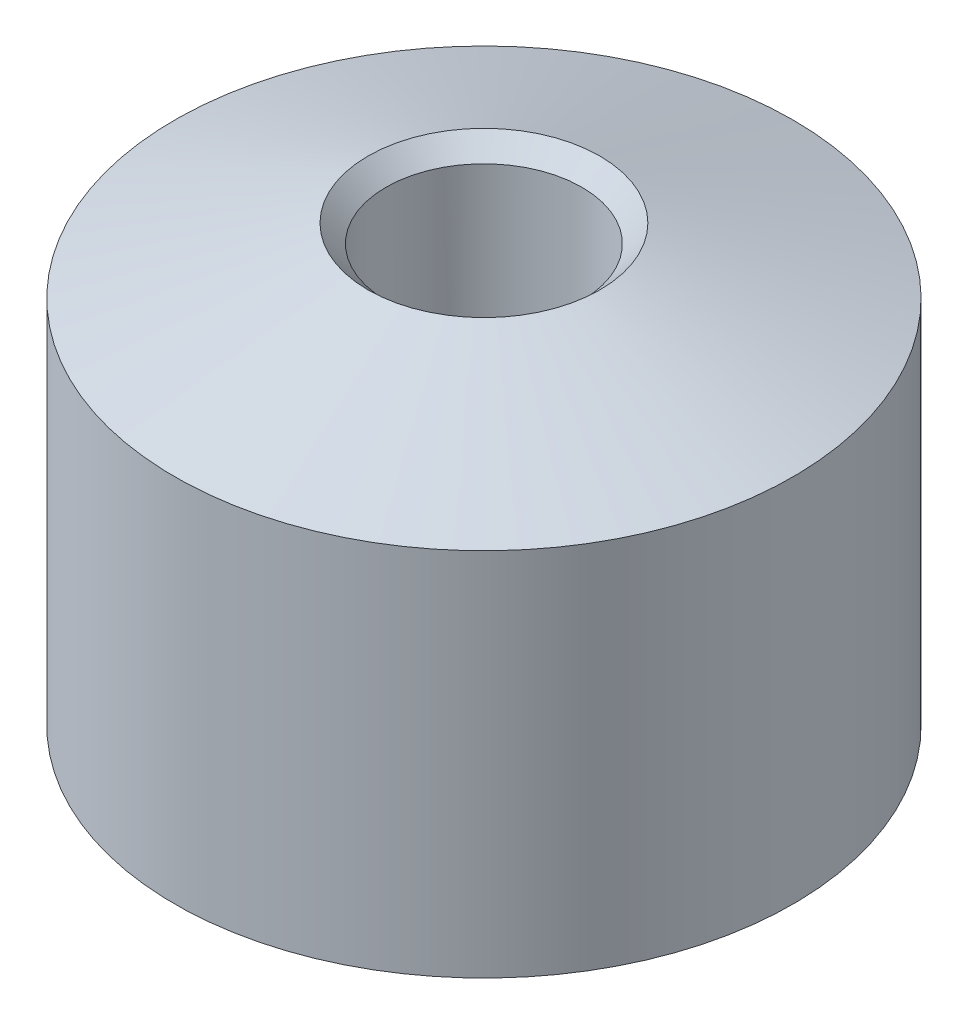
ISO-10303-21;
HEADER;
FILE_DESCRIPTION(('STEP AP214'),'2;1');
FILE_NAME('part.step','',(''),(''),'','','');
FILE_SCHEMA(('AUTOMOTIVE_DESIGN { 1 0 10303 214 1 1 1 1 }'));
ENDSEC;
DATA;
#1=APPLICATION_CONTEXT('core data for automotive mechanical design processes');
#2=APPLICATION_PROTOCOL_DEFINITION('international standard','automotive_design',2000,#1);
#3=PRODUCT_CONTEXT('',#1,'mechanical');
#4=PRODUCT('Part','Part','',(#3));
#5=PRODUCT_RELATED_PRODUCT_CATEGORY('part','',(#4));
#6=PRODUCT_DEFINITION_FORMATION('','',#4);
#7=PRODUCT_DEFINITION_CONTEXT('part definition',#1,'design');
#8=PRODUCT_DEFINITION('design','',#6,#7);
#9=PRODUCT_DEFINITION_SHAPE('','',#8);
#10=(LENGTH_UNIT() NAMED_UNIT(*) SI_UNIT(.MILLI.,.METRE.));
#11=(NAMED_UNIT(*) PLANE_ANGLE_UNIT() SI_UNIT($,.RADIAN.));
#12=(NAMED_UNIT(*) SI_UNIT($,.STERADIAN.) SOLID_ANGLE_UNIT());
#13=UNCERTAINTY_MEASURE_WITH_UNIT(LENGTH_MEASURE(1.E-05),#10,'distance_accuracy_value','');
#14=(GEOMETRIC_REPRESENTATION_CONTEXT(3) GLOBAL_UNCERTAINTY_ASSIGNED_CONTEXT((#13)) GLOBAL_UNIT_ASSIGNED_CONTEXT((#10,
#11,#12)) REPRESENTATION_CONTEXT('',''));
#15=CARTESIAN_POINT('',(0.,0.,0.));
#16=DIRECTION('',(0.,0.,1.));
#17=DIRECTION('',(1.,0.,0.));
#18=AXIS2_PLACEMENT_3D('',#15,#16,#17);
#19=CARTESIAN_POINT('',(0.,15.2,0.));
#20=DIRECTION('',(0.,-1.,0.));
#21=DIRECTION('',(0.,0.,-1.));
#22=AXIS2_PLACEMENT_3D('',#19,#20,#21);
#23=CYLINDRICAL_SURFACE('',#22,14.2);
#24=CARTESIAN_POINT('',(-13.6249770642009,27.7,-4.));
#25=CARTESIAN_POINT('',(-13.6249803259452,27.9198440682671,-3.99999572933769));
#26=CARTESIAN_POINT('',(-13.6303561674231,28.1397316880074,-3.98181400001963));
#27=CARTESIAN_POINT('',(-13.651205106593,28.5731223096656,-3.90972668695141));
#28=CARTESIAN_POINT('',(-13.6666825160762,28.7866225444502,-3.85580584803258));
#29=CARTESIAN_POINT('',(-13.7058456348098,29.2009047142681,-3.71418112512093));
#30=CARTESIAN_POINT('',(-13.7295188832796,29.4017054124067,-3.62652850377384));
#31=CARTESIAN_POINT('',(-13.7823900027917,29.7857911964634,-3.42009263281426));
#32=CARTESIAN_POINT('',(-13.8115884815341,29.9690743523498,-3.30130595832586));
#33=CARTESIAN_POINT('',(-13.8731334407927,30.3180360885306,-3.03242765551117));
#34=CARTESIAN_POINT('',(-13.9055407781593,30.4831535289306,-2.88162152784335));
#35=CARTESIAN_POINT('',(-13.9693291096081,30.7861199581109,-2.55451945045529));
#36=CARTESIAN_POINT('',(-14.0007099862523,30.9239658357816,-2.37822059651928));
#37=CARTESIAN_POINT('',(-14.0595940738432,31.1708582850003,-2.00120237609832));
#38=CARTESIAN_POINT('',(-14.087017161241,31.2793407406532,-1.80009999062994));
#39=CARTESIAN_POINT('',(-14.1341937369454,31.4607372242517,-1.38160638788408));
#40=CARTESIAN_POINT('',(-14.1539486747126,31.5336579748642,-1.16421825827217));
#41=CARTESIAN_POINT('',(-14.1831326734492,31.640027148804,-0.72518731437621));
#42=CARTESIAN_POINT('',(-14.1928113837343,31.6744315731389,-0.503793011476484));
#43=CARTESIAN_POINT('',(-14.201628023242,31.7058058437446,-0.0581774304061141));
#44=CARTESIAN_POINT('',(-14.2007679130151,31.7027826527219,0.166043314204955));
#45=CARTESIAN_POINT('',(-14.188783931876,31.6600469829958,0.604269927053761));
#46=CARTESIAN_POINT('',(-14.1779492983589,31.6213683843056,0.818385752412765));
#47=CARTESIAN_POINT('',(-14.1475793938468,31.5100982091453,1.23695468548469));
#48=CARTESIAN_POINT('',(-14.1280436000739,31.4375045950003,1.44140721179647));
#49=CARTESIAN_POINT('',(-14.0820502231798,31.2597136230961,1.83740535411256));
#50=CARTESIAN_POINT('',(-14.055520636171,31.1541748695862,2.02878898682966));
#51=CARTESIAN_POINT('',(-13.9983790235881,30.9137548017078,2.39147275972531));
#52=CARTESIAN_POINT('',(-13.9677661248636,30.7788672076573,2.56276858968766));
#53=CARTESIAN_POINT('',(-13.9045240478077,30.4781440489421,2.88658674836733));
#54=CARTESIAN_POINT('',(-13.8718617146484,30.311409016553,3.03826832828847));
#55=CARTESIAN_POINT('',(-13.8091324090739,29.9545375164735,3.31173673769813));
#56=CARTESIAN_POINT('',(-13.7790656353181,29.7643992602391,3.43352128023379));
#57=CARTESIAN_POINT('',(-13.7247868964874,29.364126618729,3.64447966744271));
#58=CARTESIAN_POINT('',(-13.7006209756511,29.1538517576243,3.73339966829775));
#59=CARTESIAN_POINT('',(-13.6614389831681,28.7204815350688,3.87433815413653));
#60=CARTESIAN_POINT('',(-13.6464203359367,28.497389801825,3.92636702718076));
#61=CARTESIAN_POINT('',(-13.6277894477523,28.0526430263992,3.99054407425941));
#62=CARTESIAN_POINT('',(-13.6238156538613,27.8311854349351,4.00395688995304));
#63=CARTESIAN_POINT('',(-13.6267305106821,27.389186422664,3.99402621413993));
#64=CARTESIAN_POINT('',(-13.633617850414,27.1686448945062,3.97068715872353));
#65=CARTESIAN_POINT('',(-13.657127186143,26.7397839678476,3.88903537544138));
#66=CARTESIAN_POINT('',(-13.6735308830927,26.5313022245224,3.83150624494543));
#67=CARTESIAN_POINT('',(-13.7140057146381,26.1269536501543,3.68400033519312));
#68=CARTESIAN_POINT('',(-13.7380779334932,25.9310886077094,3.5940189672473));
#69=CARTESIAN_POINT('',(-13.7919015361261,25.5523067442603,3.38166989211293));
#70=CARTESIAN_POINT('',(-13.8217760548052,25.3698169674843,3.25857239412488));
#71=CARTESIAN_POINT('',(-13.8835597343057,25.0276205685996,2.9843731288286));
#72=CARTESIAN_POINT('',(-13.9154693225169,24.8679187551942,2.83326546625204));
#73=CARTESIAN_POINT('',(-13.9789908549667,24.5704595627499,2.50144327360559));
#74=CARTESIAN_POINT('',(-14.0105589379841,24.4335906383049,2.31992211352595));
#75=CARTESIAN_POINT('',(-14.0687785470627,24.1922530610024,1.93575719948422));
#76=CARTESIAN_POINT('',(-14.0954303321573,24.0877827009084,1.73311455926674));
#77=CARTESIAN_POINT('',(-14.1406437373416,23.9151990628549,1.31387157574016));
#78=CARTESIAN_POINT('',(-14.1592663708218,23.8468106751325,1.09739138742653));
#79=CARTESIAN_POINT('',(-14.1865925548221,23.7475683881151,0.655401186238842));
#80=CARTESIAN_POINT('',(-14.195298579615,23.7167051258733,0.42989344035438));
#81=CARTESIAN_POINT('',(-14.2016788746809,23.6940314772947,-0.0154911312798025));
#82=CARTESIAN_POINT('',(-14.1997193688085,23.700924693787,-0.235297595069702));
#83=CARTESIAN_POINT('',(-14.1858322749311,23.7505193292825,-0.67049370650208));
#84=CARTESIAN_POINT('',(-14.1739051411901,23.7932191164399,-0.885883554968748));
#85=CARTESIAN_POINT('',(-14.1415100275298,23.9124494033117,-1.30438268922566));
#86=CARTESIAN_POINT('',(-14.1211152789307,23.9886901564674,-1.50758057336578));
#87=CARTESIAN_POINT('',(-14.0739056002594,24.1725805101965,-1.89841379604447));
#88=CARTESIAN_POINT('',(-14.047089695033,24.2802348819677,-2.08604676497163));
#89=CARTESIAN_POINT('',(-13.9889126152182,24.5275397308337,-2.4463481565054));
#90=CARTESIAN_POINT('',(-13.9574419058204,24.6680299201309,-2.61842243425182));
#91=CARTESIAN_POINT('',(-13.8939026315898,24.975461370701,-2.93699001572475));
#92=CARTESIAN_POINT('',(-13.8618339055267,25.1424098590444,-3.08347630705714));
#93=CARTESIAN_POINT('',(-13.7997849401264,25.5031002273848,-3.350407184819));
#94=CARTESIAN_POINT('',(-13.7698781493006,25.69741352791,-3.47009840424258));
#95=CARTESIAN_POINT('',(-13.7166316345286,26.1042229204277,-3.67495441673744));
#96=CARTESIAN_POINT('',(-13.6932880999998,26.3167083679376,-3.76013925669653));
#97=CARTESIAN_POINT('',(-13.658651795515,26.72330802253,-3.8839094565218));
#98=CARTESIAN_POINT('',(-13.6461331802941,26.9158571178953,-3.9273337456603));
#99=CARTESIAN_POINT('',(-13.629294955967,27.3055929177574,-3.98537880978047));
#100=CARTESIAN_POINT('',(-13.6249741381056,27.5027789342045,-4.0000038311908));
#101=CARTESIAN_POINT('',(-13.6249770642009,27.7,-4.));
#102=B_SPLINE_CURVE_WITH_KNOTS('',3,(#24,#25,#26,#27,#28,#29,#30,#31,#32,#33,#34,#35,#36,#37,
#38,#39,#40,#41,#42,#43,#44,#45,#46,#47,#48,#49,#50,#51,#52,#53,#54,#55,#56,#57,#58,#59,#60,#61,
#62,#63,#64,#65,#66,#67,#68,#69,#70,#71,#72,#73,#74,#75,#76,#77,#78,#79,#80,#81,#82,#83,#84,#85,
#86,#87,#88,#89,#90,#91,#92,#93,#94,#95,#96,#97,#98,#99,#100,#101),.UNSPECIFIED.,.T.,.F.,(4,2,2,
2,2,2,2,2,2,2,2,2,2,2,2,2,2,2,2,2,2,2,2,2,2,2,2,2,2,2,2,2,2,2,2,2,2,2,4),(0.,0.658806016600979,
1.3178934245105,1.97598313876067,2.63414527603446,3.30892036862912,3.98377239448933,
4.67079306837686,5.35768381589525,6.02711890700555,6.69642946413273,7.34692288156043,
7.99745538682293,8.65496633516823,9.31261810772238,9.9927257677828,10.6728854360016,
11.3581939520817,12.0433094175022,12.7057175894117,13.3680458122693,14.015749822881,
14.6635454536336,15.3269885801357,15.99057149965,16.6758557121263,17.3611038075391,
18.0410487826248,18.7208240688454,19.3774083060266,20.0339626217186,20.6849533173197,
21.3360429389157,22.0060739127222,22.6762882215827,23.3634739256089,24.0502598264435,
24.6413587274383,25.2323704648518),.UNSPECIFIED.);
#103=CARTESIAN_POINT('',(-13.6249770642009,27.7,-4.));
#104=VERTEX_POINT('',#103);
#105=EDGE_CURVE('E52',#104,#104,#102,.T.);
#106=ORIENTED_EDGE('',*,*,#105,.T.);
#107=EDGE_LOOP('',(#106));
#108=FACE_BOUND('',#107,.T.);
#109=CARTESIAN_POINT('',(0.,18.5,0.));
#110=DIRECTION('',(0.,-1.,0.));
#111=DIRECTION('',(0.,0.,-1.));
#112=AXIS2_PLACEMENT_3D('',#109,#110,#111);
#113=CIRCLE('',#112,14.2);
#114=CARTESIAN_POINT('',(0.,18.5,-14.2));
#115=VERTEX_POINT('',#114);
#116=EDGE_CURVE('E47',#115,#115,#113,.T.);
#117=ORIENTED_EDGE('',*,*,#116,.F.);
#118=EDGE_LOOP('',(#117));
#119=FACE_BOUND('',#118,.T.);
#120=CARTESIAN_POINT('',(0.,35.5,0.));
#121=DIRECTION('',(0.,-1.,0.));
#122=DIRECTION('',(0.,0.,-1.));
#123=AXIS2_PLACEMENT_3D('',#120,#121,#122);
#124=CIRCLE('',#123,14.2);
#125=CARTESIAN_POINT('',(0.,35.5,-14.2));
#126=VERTEX_POINT('',#125);
#127=EDGE_CURVE('E10',#126,#126,#124,.T.);
#128=ORIENTED_EDGE('',*,*,#127,.T.);
#129=EDGE_LOOP('',(#128));
#130=FACE_BOUND('',#129,.T.);
#131=ADVANCED_FACE('F31',(#108,#119,#130),#23,.T.);
#132=CARTESIAN_POINT('',(0.,38.5,0.));
#133=DIRECTION('',(0.,-1.,0.));
#134=DIRECTION('',(0.,0.,-1.));
#135=AXIS2_PLACEMENT_3D('',#132,#133,#134);
#136=CONICAL_SURFACE('',#135,5.32658572705139,1.24477217622328);
#137=ORIENTED_EDGE('',*,*,#127,.F.);
#138=EDGE_LOOP('',(#137));
#139=FACE_BOUND('',#138,.T.);
#140=CARTESIAN_POINT('',(0.,38.5,0.));
#141=DIRECTION('',(0.,-1.,0.));
#142=DIRECTION('',(0.,0.,-1.));
#143=AXIS2_PLACEMENT_3D('',#140,#141,#142);
#144=CIRCLE('',#143,5.32658572705139);
#145=CARTESIAN_POINT('',(0.,38.5,-5.32658572705139));
#146=VERTEX_POINT('',#145);
#147=EDGE_CURVE('E43',#146,#146,#144,.T.);
#148=ORIENTED_EDGE('',*,*,#147,.T.);
#149=EDGE_LOOP('',(#148));
#150=FACE_BOUND('',#149,.T.);
#151=ADVANCED_FACE('F73',(#139,#150),#136,.T.);
#152=CARTESIAN_POINT('',(0.,37.1734142729486,0.));
#153=DIRECTION('',(0.,1.,0.));
#154=DIRECTION('',(0.,0.,1.));
#155=AXIS2_PLACEMENT_3D('',#152,#153,#154);
#156=CONICAL_SURFACE('',#155,4.,0.785398163397454);
#157=CARTESIAN_POINT('',(0.,37.6734142729486,0.));
#158=DIRECTION('',(0.,1.,0.));
#159=DIRECTION('',(0.,0.,1.));
#160=AXIS2_PLACEMENT_3D('',#157,#158,#159);
#161=CIRCLE('',#160,4.5);
#162=CARTESIAN_POINT('',(0.,37.6734142729486,4.5));
#163=VERTEX_POINT('',#162);
#164=EDGE_CURVE('E57',#163,#163,#161,.F.);
#165=ORIENTED_EDGE('',*,*,#164,.T.);
#166=EDGE_LOOP('',(#165));
#167=FACE_BOUND('',#166,.T.);
#168=ORIENTED_EDGE('',*,*,#147,.F.);
#169=EDGE_LOOP('',(#168));
#170=FACE_BOUND('',#169,.T.);
#171=ADVANCED_FACE('F70',(#167,#170),#156,.F.);
#172=CARTESIAN_POINT('',(-14.2,18.5,0.));
#173=DIRECTION('',(0.,1.,0.));
#174=DIRECTION('',(0.,0.,1.));
#175=AXIS2_PLACEMENT_3D('',#172,#173,#174);
#176=PLANE('',#175);
#177=CARTESIAN_POINT('',(0.,18.5,0.));
#178=DIRECTION('',(0.,-1.,0.));
#179=DIRECTION('',(0.,0.,-1.));
#180=AXIS2_PLACEMENT_3D('',#177,#178,#179);
#181=CIRCLE('',#180,4.5);
#182=CARTESIAN_POINT('',(0.,18.5,-4.5));
#183=VERTEX_POINT('',#182);
#184=EDGE_CURVE('E129',#183,#183,#181,.T.);
#185=ORIENTED_EDGE('',*,*,#184,.F.);
#186=EDGE_LOOP('',(#185));
#187=FACE_BOUND('',#186,.T.);
#188=ORIENTED_EDGE('',*,*,#116,.T.);
#189=EDGE_LOOP('',(#188));
#190=FACE_BOUND('',#189,.T.);
#191=ADVANCED_FACE('F64',(#187,#190),#176,.F.);
#192=CARTESIAN_POINT('',(-22.,27.7,0.));
#193=DIRECTION('',(1.,0.,0.));
#194=DIRECTION('',(0.,0.,-1.));
#195=AXIS2_PLACEMENT_3D('',#192,#193,#194);
#196=CYLINDRICAL_SURFACE('',#195,4.);
#197=CARTESIAN_POINT('',(-2.06155281280883,27.7,-4.));
#198=CARTESIAN_POINT('',(-2.06157232572336,27.8239395470671,-3.99999429197519));
#199=CARTESIAN_POINT('',(-2.07299393441384,27.947911693776,-3.99416510904789));
#200=CARTESIAN_POINT('',(-2.11588343130024,28.1914764920929,-3.97159323007976));
#201=CARTESIAN_POINT('',(-2.1474199570369,28.3110526600617,-3.95481316209366));
#202=CARTESIAN_POINT('',(-2.21437033578483,28.5123433223603,-3.91760247522202));
#203=CARTESIAN_POINT('',(-2.24649278259112,28.5956324294352,-3.89934762805006));
#204=CARTESIAN_POINT('',(-2.31633692646814,28.7586999236626,-3.85826702162666));
#205=CARTESIAN_POINT('',(-2.35406207800946,28.8384761052185,-3.83543843928572));
#206=CARTESIAN_POINT('',(-2.43355095725201,28.9948834312965,-3.78550385448353));
#207=CARTESIAN_POINT('',(-2.47532622314797,29.0715046485088,-3.75838548364778));
#208=CARTESIAN_POINT('',(-2.56157495334366,29.2216551208025,-3.70014161959085));
#209=CARTESIAN_POINT('',(-2.60604930770418,29.2951833422446,-3.66901480069177));
#210=CARTESIAN_POINT('',(-2.72632565248152,29.4864727410372,-3.58130252155353));
#211=CARTESIAN_POINT('',(-2.80362244886156,29.6017690561442,-3.52136411785635));
#212=CARTESIAN_POINT('',(-2.95981072978571,29.825284700705,-3.39114903086818));
#213=CARTESIAN_POINT('',(-3.03870312747774,29.9334998184938,-3.32086627439562));
#214=CARTESIAN_POINT('',(-3.1957508875604,30.1428680975343,-3.17001834577851));
#215=CARTESIAN_POINT('',(-3.27390696079882,30.2440288423861,-3.08946448734927));
#216=CARTESIAN_POINT('',(-3.42766790862015,30.4390673846973,-2.91793880021797));
#217=CARTESIAN_POINT('',(-3.50327397766545,30.5329486195361,-2.82697193940038));
#218=CARTESIAN_POINT('',(-3.68889708805164,30.7601054687808,-2.58382266370203));
#219=CARTESIAN_POINT('',(-3.79616515582301,30.8882189475254,-2.42455638649925));
#220=CARTESIAN_POINT('',(-3.9945344287203,31.1220004254465,-2.08155060145403));
#221=CARTESIAN_POINT('',(-4.0856633531668,31.227706971732,-1.89785402255123));
#222=CARTESIAN_POINT('',(-4.22981526927993,31.3935993055705,-1.54518043581156));
#223=CARTESIAN_POINT('',(-4.28679531259206,31.4586284540199,-1.38015066267631));
#224=CARTESIAN_POINT('',(-4.35835001530902,31.5399709366386,-1.12369897766938));
#225=CARTESIAN_POINT('',(-4.37988638136631,31.5643893964895,-1.03670531297222));
#226=CARTESIAN_POINT('',(-4.41793123914965,31.6074569017096,-0.860240950969841));
#227=CARTESIAN_POINT('',(-4.43444186951122,31.6261084011862,-0.770771325008668));
#228=CARTESIAN_POINT('',(-4.4621837606885,31.6574154050639,-0.589395112689556));
#229=CARTESIAN_POINT('',(-4.47338167146149,31.6700330363144,-0.497476860437155));
#230=CARTESIAN_POINT('',(-4.49009531214985,31.6888563105549,-0.312511019748289));
#231=CARTESIAN_POINT('',(-4.49561351829748,31.6950647478227,-0.219463941374009));
#232=CARTESIAN_POINT('',(-4.50084496929612,31.7009508423794,-0.0329933459090703));
#233=CARTESIAN_POINT('',(-4.50055818606791,31.7006284680782,0.0604301730002788));
#234=CARTESIAN_POINT('',(-4.49419637559973,31.6934699566861,0.246799990171686));
#235=CARTESIAN_POINT('',(-4.4881217015807,31.6866342170902,0.339746317207598));
#236=CARTESIAN_POINT('',(-4.46302477107748,31.6583671117833,0.599724396827661));
#237=CARTESIAN_POINT('',(-4.4374859928167,31.6295816955466,0.765419006201974));
#238=CARTESIAN_POINT('',(-4.36950350733363,31.5526457524466,1.08847850771434));
#239=CARTESIAN_POINT('',(-4.32705564180154,31.5044904620845,1.24584134009596));
#240=CARTESIAN_POINT('',(-4.22478967577912,31.3877763543819,1.55880397008763));
#241=CARTESIAN_POINT('',(-4.164066779093,31.3181483413905,1.71370522626957));
#242=CARTESIAN_POINT('',(-4.02988000501986,31.1628659860849,2.00909427569594));
#243=CARTESIAN_POINT('',(-3.95641334375456,31.0772081417273,2.14957890893113));
#244=CARTESIAN_POINT('',(-3.7589290240476,30.8440841845586,2.48506371857048));
#245=CARTESIAN_POINT('',(-3.62854843017736,30.6877010918657,2.6702193668769));
#246=CARTESIAN_POINT('',(-3.42409900099086,30.4343942022579,2.92187832396824));
#247=CARTESIAN_POINT('',(-3.35426577225646,30.3465699164822,3.00160123071585));
#248=CARTESIAN_POINT('',(-3.21295257713828,30.1650205241992,3.15239285283664));
#249=CARTESIAN_POINT('',(-3.1414732692264,30.0712977520971,3.22346495961088));
#250=CARTESIAN_POINT('',(-2.99660561780474,29.875790906055,3.3586314540191));
#251=CARTESIAN_POINT('',(-2.92321243867275,29.7738677960785,3.42251874825569));
#252=CARTESIAN_POINT('',(-2.77804242535028,29.5636830974139,3.54136615718157));
#253=CARTESIAN_POINT('',(-2.70626687199907,29.4554167144882,3.59631939796526));
#254=CARTESIAN_POINT('',(-2.56734106849352,29.2325827845073,3.69676359686218));
#255=CARTESIAN_POINT('',(-2.50016922857522,29.118049937834,3.74230108067713));
#256=CARTESIAN_POINT('',(-2.37396586210146,28.8814101701551,3.8235965665823));
#257=CARTESIAN_POINT('',(-2.31491926366681,28.7593178987979,3.8593727998529));
#258=CARTESIAN_POINT('',(-2.2186905076944,28.525872015822,3.91535936749022));
#259=CARTESIAN_POINT('',(-2.17954652820106,28.4157249764672,3.93711232323145));
#260=CARTESIAN_POINT('',(-2.1162407192719,28.1900066006444,3.971503976096));
#261=CARTESIAN_POINT('',(-2.0920295495596,28.0744544998895,3.98417271167486));
#262=CARTESIAN_POINT('',(-2.06289699804779,27.8387841434735,3.99934696754074));
#263=CARTESIAN_POINT('',(-2.05819472834106,27.7186292387994,4.00173705515319));
#264=CARTESIAN_POINT('',(-2.06984726955205,27.4795517655682,3.99571686503406));
#265=CARTESIAN_POINT('',(-2.08622987365874,27.3606310322914,3.98729233196468));
#266=CARTESIAN_POINT('',(-2.14161375249704,27.1038188940678,3.95785418646432));
#267=CARTESIAN_POINT('',(-2.18459301805054,26.9670921922334,3.93459682188722));
#268=CARTESIAN_POINT('',(-2.28690867576113,26.7024949807325,3.87601598173881));
#269=CARTESIAN_POINT('',(-2.34630735460757,26.5746605623896,3.84064643433976));
#270=CARTESIAN_POINT('',(-2.46862734447516,26.3386352415234,3.76306617049747));
#271=CARTESIAN_POINT('',(-2.53074525731462,26.229713135927,3.72176251136684));
#272=CARTESIAN_POINT('',(-2.65935871799111,26.0179576816065,3.6309798841043));
#273=CARTESIAN_POINT('',(-2.7258576186662,25.9151291134079,3.58149460968924));
#274=CARTESIAN_POINT('',(-2.86095518285462,25.7149269550526,3.47453279690188));
#275=CARTESIAN_POINT('',(-2.92955679618135,25.6175616266588,3.41704459003937));
#276=CARTESIAN_POINT('',(-3.06705098196198,25.4282099861044,3.29419189474922));
#277=CARTESIAN_POINT('',(-3.13594346728501,25.3362221708635,3.22882962300396));
#278=CARTESIAN_POINT('',(-3.27764319591716,25.1511297820269,3.08511970053201));
#279=CARTESIAN_POINT('',(-3.35037216604475,25.0584277081496,3.00617418354753));
#280=CARTESIAN_POINT('',(-3.49317067373993,24.8795142003269,2.8389880388223));
#281=CARTESIAN_POINT('',(-3.56323961525315,24.7933042169099,2.75074534431614));
#282=CARTESIAN_POINT('',(-3.69911223819883,24.6282549767419,2.56510319613268));
#283=CARTESIAN_POINT('',(-3.76492686426249,24.5493965554475,2.4677289584498));
#284=CARTESIAN_POINT('',(-3.89103111184092,24.3997358646936,2.26368810877397));
#285=CARTESIAN_POINT('',(-3.95132121491947,24.3289328929233,2.15702230829572));
#286=CARTESIAN_POINT('',(-4.08644950214891,24.1713620559956,1.89222850358014));
#287=CARTESIAN_POINT('',(-4.15814299316217,24.0887116304054,1.72991628864099));
#288=CARTESIAN_POINT('',(-4.25238633936574,23.9807135678493,1.47494392636267));
#289=CARTESIAN_POINT('',(-4.28159046474189,23.9473705953623,1.38801185435656));
#290=CARTESIAN_POINT('',(-4.33506519908358,23.8864708795266,1.21068881847059));
#291=CARTESIAN_POINT('',(-4.3593382375382,23.8589112865524,1.12029958410676));
#292=CARTESIAN_POINT('',(-4.40265386302156,23.8098206690862,0.935787751250171));
#293=CARTESIAN_POINT('',(-4.42164943106534,23.7883438070583,0.841639637896805));
#294=CARTESIAN_POINT('',(-4.45369481924323,23.7521564912264,0.65109759417273));
#295=CARTESIAN_POINT('',(-4.46674762426481,23.7374426405112,0.554704816866411));
#296=CARTESIAN_POINT('',(-4.48659899968497,23.7150787804437,0.360491472890657));
#297=CARTESIAN_POINT('',(-4.4933994994065,23.7074265920161,0.262671356138136));
#298=CARTESIAN_POINT('',(-4.50057867746829,23.6993485615228,0.0665042113654272));
#299=CARTESIAN_POINT('',(-4.5009580811224,23.6989219032761,-0.0318427558873957));
#300=CARTESIAN_POINT('',(-4.49563229819897,23.7049141088158,-0.216157972528746));
#301=CARTESIAN_POINT('',(-4.49066216216396,23.7105059946281,-0.302175767692046));
#302=CARTESIAN_POINT('',(-4.47586944790254,23.7271646280077,-0.473266618864104));
#303=CARTESIAN_POINT('',(-4.46604535900241,23.7382330800233,-0.558339372318297));
#304=CARTESIAN_POINT('',(-4.42954708693647,23.7794059782744,-0.811178992004077));
#305=CARTESIAN_POINT('',(-4.39584154488748,23.8174838989513,-0.976735360226998));
#306=CARTESIAN_POINT('',(-4.3116716701741,23.9130450363256,-1.29905391722648));
#307=CARTESIAN_POINT('',(-4.26106990949399,23.9706874494235,-1.45573124424074));
#308=CARTESIAN_POINT('',(-4.14616398639169,24.1025409714144,-1.75649823947431));
#309=CARTESIAN_POINT('',(-4.08185364214263,24.1767595559841,-1.90058218729294));
#310=CARTESIAN_POINT('',(-3.90920034955971,24.3779949659593,-2.24047984148572));
#311=CARTESIAN_POINT('',(-3.79448212587675,24.5133140292203,-2.42820612314634));
#312=CARTESIAN_POINT('',(-3.61167397242595,24.7342153550453,-2.68645530264436));
#313=CARTESIAN_POINT('',(-3.54883353427165,24.8109819745668,-2.76876818038312));
#314=CARTESIAN_POINT('',(-3.42058331180834,24.9700527139712,-2.92572291482469));
#315=CARTESIAN_POINT('',(-3.3551738871357,25.0523560599011,-3.00036584000265));
#316=CARTESIAN_POINT('',(-3.22145966617411,25.2239626075463,-3.14356577771544));
#317=CARTESIAN_POINT('',(-3.15312285179936,25.3133783951388,-3.21195707988456));
#318=CARTESIAN_POINT('',(-3.01614586353152,25.4975175000722,-3.34091431488864));
#319=CARTESIAN_POINT('',(-2.94750561219304,25.5922422541975,-3.40147811453468));
#320=CARTESIAN_POINT('',(-2.81153893451064,25.7869874134264,-3.5146917748899));
#321=CARTESIAN_POINT('',(-2.74421088967237,25.887000644395,-3.56735200279424));
#322=CARTESIAN_POINT('',(-2.61280912867062,26.0928146421123,-3.66468343209588));
#323=CARTESIAN_POINT('',(-2.54873337195515,26.1986116912049,-3.7093596882952));
#324=CARTESIAN_POINT('',(-2.42124402397358,26.4263664231271,-3.79393041039363));
#325=CARTESIAN_POINT('',(-2.35838339761881,26.548927258623,-3.83305970359868));
#326=CARTESIAN_POINT('',(-2.24551055989229,26.8026978063231,-3.90025526662931));
#327=CARTESIAN_POINT('',(-2.19546955396539,26.9338872887861,-3.92834640679056));
#328=CARTESIAN_POINT('',(-2.12614421116692,27.1709586478861,-3.96619343942528));
#329=CARTESIAN_POINT('',(-2.10230432537319,27.2750100848655,-3.97877292930854));
#330=CARTESIAN_POINT('',(-2.07001639409719,27.4860373403463,-3.9956699823414));
#331=CARTESIAN_POINT('',(-2.06153596786609,27.5930065229328,-4.00000492757506));
#332=CARTESIAN_POINT('',(-2.06155281280883,27.7,-4.));
#333=B_SPLINE_CURVE_WITH_KNOTS('',3,(#197,#198,#199,#200,#201,#202,#203,#204,#205,#206,#207,
#208,#209,#210,#211,#212,#213,#214,#215,#216,#217,#218,#219,#220,#221,#222,#223,#224,#225,#226,
#227,#228,#229,#230,#231,#232,#233,#234,#235,#236,#237,#238,#239,#240,#241,#242,#243,#244,#245,
#246,#247,#248,#249,#250,#251,#252,#253,#254,#255,#256,#257,#258,#259,#260,#261,#262,#263,#264,
#265,#266,#267,#268,#269,#270,#271,#272,#273,#274,#275,#276,#277,#278,#279,#280,#281,#282,#283,
#284,#285,#286,#287,#288,#289,#290,#291,#292,#293,#294,#295,#296,#297,#298,#299,#300,#301,#302,
#303,#304,#305,#306,#307,#308,#309,#310,#311,#312,#313,#314,#315,#316,#317,#318,#319,#320,#321,
#322,#323,#324,#325,#326,#327,#328,#329,#330,#331,#332),.UNSPECIFIED.,.T.,.F.,(4,2,2,2,2,2,2,2,
2,2,2,2,2,2,2,2,2,2,2,2,2,2,2,2,2,2,2,2,2,2,2,2,2,2,2,2,2,2,2,2,2,2,2,2,2,2,2,2,2,2,2,2,2,2,2,2,
2,2,2,2,2,2,2,2,2,2,2,4),(0.,0.371336912187403,0.743947755015358,1.01692856141173,
1.29007838430763,1.56403061372294,1.83807367869464,2.29104510145082,2.74428353299209,
3.1970269626847,3.64955528861731,4.33941738557285,5.02808288998033,5.58450485927153,
5.86286969420036,6.14111590851372,6.42108640117483,6.70093478079528,6.9807845140664,
7.26061716988126,7.76843928437684,8.27638636047339,8.81545000004384,9.35463154682997,
10.1753935259791,10.5880423454033,11.0005288681491,11.4228630349943,11.84552062557,
12.2660370272273,12.6857625647099,13.0414038437951,13.3958636449969,13.754293921778,
14.1131971504402,14.5463458561892,14.9811608009827,15.3766826009093,15.7725106974763,
16.168922087374,16.5652221404098,16.9902524473679,17.4153774388493,17.8393612374755,
18.2633080428879,18.8479073478176,19.1403581368824,19.4326644875252,19.7274971882622,
20.0221816387766,20.3167751256457,20.6113353356168,20.8700389548855,21.1288231400716,
21.6458930123255,22.1672753785622,22.6888933592113,23.4591967652008,23.8456636277005,
24.2320765796121,24.6268123517836,25.0216554734398,25.4159760617934,25.8100461070444,
26.2387444998971,26.6664713659397,26.9877139683642,27.3082785366438),.UNSPECIFIED.);
#334=CARTESIAN_POINT('',(-2.06155281280883,27.7,-4.));
#335=VERTEX_POINT('',#334);
#336=EDGE_CURVE('E35',#335,#335,#333,.T.);
#337=ORIENTED_EDGE('',*,*,#336,.T.);
#338=EDGE_LOOP('',(#337));
#339=FACE_BOUND('',#338,.T.);
#340=ORIENTED_EDGE('',*,*,#105,.F.);
#341=EDGE_LOOP('',(#340));
#342=FACE_BOUND('',#341,.T.);
#343=ADVANCED_FACE('F59',(#339,#342),#196,.F.);
#344=CARTESIAN_POINT('',(0.,50.5,0.));
#345=DIRECTION('',(0.,-1.,0.));
#346=DIRECTION('',(0.,0.,-1.));
#347=AXIS2_PLACEMENT_3D('',#344,#345,#346);
#348=CYLINDRICAL_SURFACE('',#347,4.5);
#349=ORIENTED_EDGE('',*,*,#336,.F.);
#350=EDGE_LOOP('',(#349));
#351=FACE_BOUND('',#350,.T.);
#352=ORIENTED_EDGE('',*,*,#184,.T.);
#353=EDGE_LOOP('',(#352));
#354=FACE_BOUND('',#353,.T.);
#355=ORIENTED_EDGE('',*,*,#164,.F.);
#356=EDGE_LOOP('',(#355));
#357=FACE_BOUND('',#356,.T.);
#358=ADVANCED_FACE('F63',(#351,#354,#357),#348,.F.);
#359=CLOSED_SHELL('',(#131,#151,#171,#191,#343,#358));
#360=MANIFOLD_SOLID_BREP('B2',#359);
#361=ADVANCED_BREP_SHAPE_REPRESENTATION('',(#18,#360),#14);
#362=SHAPE_DEFINITION_REPRESENTATION(#9,#361);
ENDSEC;
END-ISO-10303-21;
